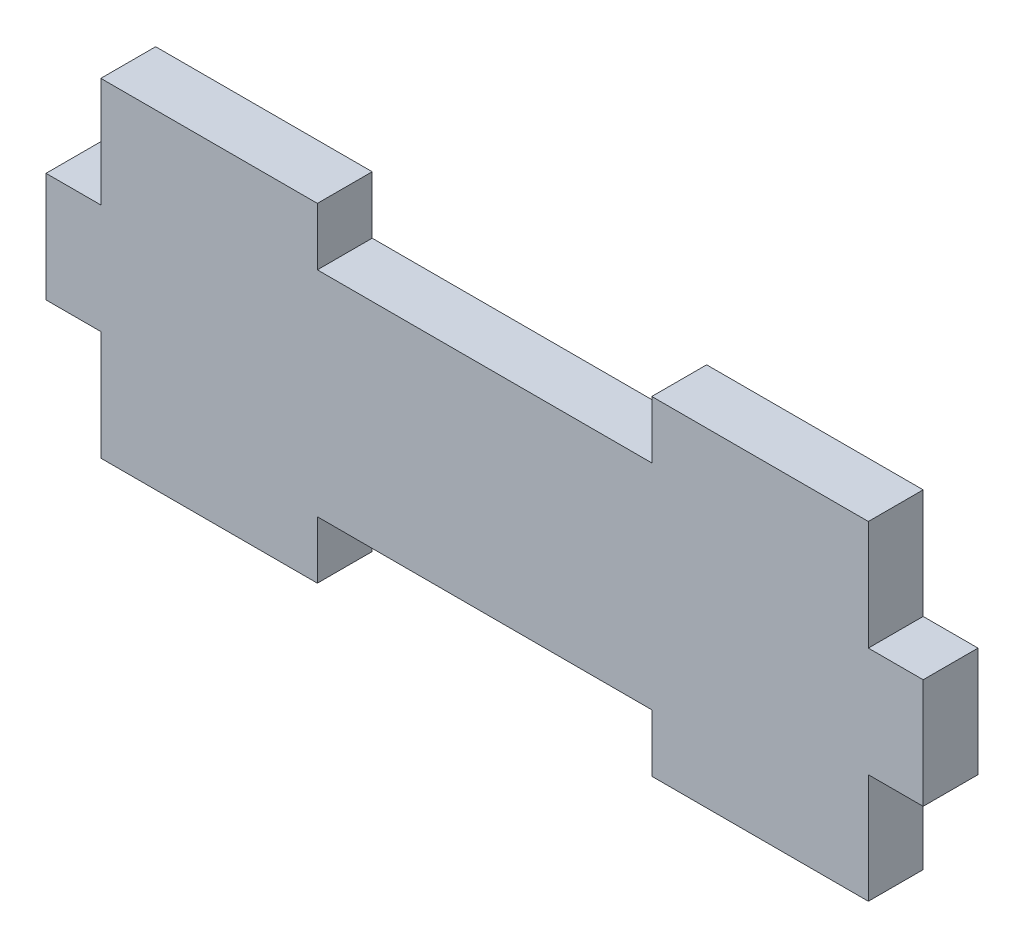
ISO-10303-21;
HEADER;
FILE_DESCRIPTION(('STEP AP214'),'2;1');
FILE_NAME('part.step','',(''),(''),'','','');
FILE_SCHEMA(('AUTOMOTIVE_DESIGN { 1 0 10303 214 1 1 1 1 }'));
ENDSEC;
DATA;
#1=APPLICATION_CONTEXT('core data for automotive mechanical design processes');
#2=APPLICATION_PROTOCOL_DEFINITION('international standard','automotive_design',2000,#1);
#3=PRODUCT_CONTEXT('',#1,'mechanical');
#4=PRODUCT('Part','Part','',(#3));
#5=PRODUCT_RELATED_PRODUCT_CATEGORY('part','',(#4));
#6=PRODUCT_DEFINITION_FORMATION('','',#4);
#7=PRODUCT_DEFINITION_CONTEXT('part definition',#1,'design');
#8=PRODUCT_DEFINITION('design','',#6,#7);
#9=PRODUCT_DEFINITION_SHAPE('','',#8);
#10=(LENGTH_UNIT() NAMED_UNIT(*) SI_UNIT(.MILLI.,.METRE.));
#11=(NAMED_UNIT(*) PLANE_ANGLE_UNIT() SI_UNIT($,.RADIAN.));
#12=(NAMED_UNIT(*) SI_UNIT($,.STERADIAN.) SOLID_ANGLE_UNIT());
#13=UNCERTAINTY_MEASURE_WITH_UNIT(LENGTH_MEASURE(1.E-05),#10,'distance_accuracy_value','');
#14=(GEOMETRIC_REPRESENTATION_CONTEXT(3) GLOBAL_UNCERTAINTY_ASSIGNED_CONTEXT((#13)) GLOBAL_UNIT_ASSIGNED_CONTEXT((#10,
#11,#12)) REPRESENTATION_CONTEXT('',''));
#15=CARTESIAN_POINT('',(0.,0.,0.));
#16=DIRECTION('',(0.,0.,1.));
#17=DIRECTION('',(1.,0.,0.));
#18=AXIS2_PLACEMENT_3D('',#15,#16,#17);
#19=CARTESIAN_POINT('',(-161.50297554201,-123.72908659893,2.5));
#20=DIRECTION('',(0.,-1.,0.));
#21=DIRECTION('',(1.,0.,0.));
#22=AXIS2_PLACEMENT_3D('',#19,#20,#21);
#23=PLANE('',#22);
#24=DIRECTION('',(-1.,0.,0.));
#25=VECTOR('',#24,1.);
#26=CARTESIAN_POINT('',(-161.50297554201,-123.72908659893,-2.5));
#27=LINE('',#26,#25);
#28=CARTESIAN_POINT('',(-161.50297554201,-123.72908659893,-2.5));
#29=VERTEX_POINT('',#28);
#30=CARTESIAN_POINT('',(-181.252975542007,-123.72908659893,-2.5));
#31=VERTEX_POINT('',#30);
#32=EDGE_CURVE('E201',#29,#31,#27,.T.);
#33=ORIENTED_EDGE('',*,*,#32,.T.);
#34=DIRECTION('',(0.,0.,-1.));
#35=VECTOR('',#34,1.);
#36=CARTESIAN_POINT('',(-181.252975542007,-123.72908659893,2.5));
#37=LINE('',#36,#35);
#38=CARTESIAN_POINT('',(-181.252975542007,-123.72908659893,2.5));
#39=VERTEX_POINT('',#38);
#40=EDGE_CURVE('E11',#39,#31,#37,.T.);
#41=ORIENTED_EDGE('',*,*,#40,.F.);
#42=DIRECTION('',(-1.,0.,0.));
#43=VECTOR('',#42,1.);
#44=CARTESIAN_POINT('',(-161.50297554201,-123.72908659893,2.5));
#45=LINE('',#44,#43);
#46=CARTESIAN_POINT('',(-161.50297554201,-123.72908659893,2.5));
#47=VERTEX_POINT('',#46);
#48=EDGE_CURVE('E239',#47,#39,#45,.T.);
#49=ORIENTED_EDGE('',*,*,#48,.F.);
#50=DIRECTION('',(0.,0.,-1.));
#51=VECTOR('',#50,1.);
#52=CARTESIAN_POINT('',(-161.50297554201,-123.72908659893,2.5));
#53=LINE('',#52,#51);
#54=EDGE_CURVE('E197',#47,#29,#53,.T.);
#55=ORIENTED_EDGE('',*,*,#54,.T.);
#56=EDGE_LOOP('',(#33,#41,#49,#55));
#57=FACE_BOUND('',#56,.T.);
#58=ADVANCED_FACE('F33',(#57),#23,.F.);
#59=CARTESIAN_POINT('',(-181.252975542007,-123.72908659893,2.5));
#60=DIRECTION('',(1.,0.,0.));
#61=DIRECTION('',(0.,0.,-1.));
#62=AXIS2_PLACEMENT_3D('',#59,#60,#61);
#63=PLANE('',#62);
#64=DIRECTION('',(0.,-1.,0.));
#65=VECTOR('',#64,1.);
#66=CARTESIAN_POINT('',(-181.252975542007,-123.72908659893,-2.5));
#67=LINE('',#66,#65);
#68=CARTESIAN_POINT('',(-181.252975542007,-133.72908659893,-2.5));
#69=VERTEX_POINT('',#68);
#70=EDGE_CURVE('E204',#31,#69,#67,.T.);
#71=ORIENTED_EDGE('',*,*,#70,.T.);
#72=DIRECTION('',(0.,0.,-1.));
#73=VECTOR('',#72,1.);
#74=CARTESIAN_POINT('',(-181.252975542007,-133.72908659893,2.5));
#75=LINE('',#74,#73);
#76=CARTESIAN_POINT('',(-181.252975542007,-133.72908659893,2.5));
#77=VERTEX_POINT('',#76);
#78=EDGE_CURVE('E41',#77,#69,#75,.T.);
#79=ORIENTED_EDGE('',*,*,#78,.F.);
#80=DIRECTION('',(0.,-1.,0.));
#81=VECTOR('',#80,1.);
#82=CARTESIAN_POINT('',(-181.252975542007,-123.72908659893,2.5));
#83=LINE('',#82,#81);
#84=EDGE_CURVE('E128',#39,#77,#83,.T.);
#85=ORIENTED_EDGE('',*,*,#84,.F.);
#86=ORIENTED_EDGE('',*,*,#40,.T.);
#87=EDGE_LOOP('',(#71,#79,#85,#86));
#88=FACE_BOUND('',#87,.T.);
#89=ADVANCED_FACE('F357',(#88),#63,.F.);
#90=CARTESIAN_POINT('',(-181.252975542007,-133.72908659893,2.5));
#91=DIRECTION('',(0.,-1.,0.));
#92=DIRECTION('',(0.,0.,-1.));
#93=AXIS2_PLACEMENT_3D('',#90,#91,#92);
#94=PLANE('',#93);
#95=DIRECTION('',(-1.,0.,0.));
#96=VECTOR('',#95,1.);
#97=CARTESIAN_POINT('',(-181.252975542007,-133.72908659893,-2.5));
#98=LINE('',#97,#96);
#99=CARTESIAN_POINT('',(-186.252975542008,-133.72908659893,-2.5));
#100=VERTEX_POINT('',#99);
#101=EDGE_CURVE('E206',#69,#100,#98,.T.);
#102=ORIENTED_EDGE('',*,*,#101,.T.);
#103=DIRECTION('',(0.,0.,-1.));
#104=VECTOR('',#103,1.);
#105=CARTESIAN_POINT('',(-186.252975542008,-133.72908659893,2.5));
#106=LINE('',#105,#104);
#107=CARTESIAN_POINT('',(-186.252975542008,-133.72908659893,2.5));
#108=VERTEX_POINT('',#107);
#109=EDGE_CURVE('E282',#108,#100,#106,.T.);
#110=ORIENTED_EDGE('',*,*,#109,.F.);
#111=DIRECTION('',(-1.,0.,0.));
#112=VECTOR('',#111,1.);
#113=CARTESIAN_POINT('',(-181.252975542007,-133.72908659893,2.5));
#114=LINE('',#113,#112);
#115=EDGE_CURVE('E290',#77,#108,#114,.T.);
#116=ORIENTED_EDGE('',*,*,#115,.F.);
#117=ORIENTED_EDGE('',*,*,#78,.T.);
#118=EDGE_LOOP('',(#102,#110,#116,#117));
#119=FACE_BOUND('',#118,.T.);
#120=ADVANCED_FACE('F288',(#119),#94,.F.);
#121=CARTESIAN_POINT('',(-186.252975542008,-133.72908659893,2.5));
#122=DIRECTION('',(1.,0.,0.));
#123=DIRECTION('',(0.,0.,-1.));
#124=AXIS2_PLACEMENT_3D('',#121,#122,#123);
#125=PLANE('',#124);
#126=DIRECTION('',(0.,-1.,0.));
#127=VECTOR('',#126,1.);
#128=CARTESIAN_POINT('',(-186.252975542008,-133.72908659893,-2.5));
#129=LINE('',#128,#127);
#130=CARTESIAN_POINT('',(-186.252975542008,-143.72908659893,-2.5));
#131=VERTEX_POINT('',#130);
#132=EDGE_CURVE('E208',#100,#131,#129,.T.);
#133=ORIENTED_EDGE('',*,*,#132,.T.);
#134=DIRECTION('',(0.,0.,-1.));
#135=VECTOR('',#134,1.);
#136=CARTESIAN_POINT('',(-186.252975542008,-143.72908659893,2.5));
#137=LINE('',#136,#135);
#138=CARTESIAN_POINT('',(-186.252975542008,-143.72908659893,2.5));
#139=VERTEX_POINT('',#138);
#140=EDGE_CURVE('E279',#139,#131,#137,.T.);
#141=ORIENTED_EDGE('',*,*,#140,.F.);
#142=DIRECTION('',(0.,-1.,0.));
#143=VECTOR('',#142,1.);
#144=CARTESIAN_POINT('',(-186.252975542008,-133.72908659893,2.5));
#145=LINE('',#144,#143);
#146=EDGE_CURVE('E308',#108,#139,#145,.T.);
#147=ORIENTED_EDGE('',*,*,#146,.F.);
#148=ORIENTED_EDGE('',*,*,#109,.T.);
#149=EDGE_LOOP('',(#133,#141,#147,#148));
#150=FACE_BOUND('',#149,.T.);
#151=ADVANCED_FACE('F299',(#150),#125,.F.);
#152=CARTESIAN_POINT('',(-186.252975542008,-143.72908659893,2.5));
#153=DIRECTION('',(0.,1.,0.));
#154=DIRECTION('',(0.,0.,1.));
#155=AXIS2_PLACEMENT_3D('',#152,#153,#154);
#156=PLANE('',#155);
#157=DIRECTION('',(1.,0.,0.));
#158=VECTOR('',#157,1.);
#159=CARTESIAN_POINT('',(-186.252975542008,-143.72908659893,-2.5));
#160=LINE('',#159,#158);
#161=CARTESIAN_POINT('',(-181.252975542007,-143.72908659893,-2.5));
#162=VERTEX_POINT('',#161);
#163=EDGE_CURVE('E210',#131,#162,#160,.T.);
#164=ORIENTED_EDGE('',*,*,#163,.T.);
#165=DIRECTION('',(0.,0.,-1.));
#166=VECTOR('',#165,1.);
#167=CARTESIAN_POINT('',(-181.252975542007,-143.72908659893,2.5));
#168=LINE('',#167,#166);
#169=CARTESIAN_POINT('',(-181.252975542007,-143.72908659893,2.5));
#170=VERTEX_POINT('',#169);
#171=EDGE_CURVE('E276',#170,#162,#168,.T.);
#172=ORIENTED_EDGE('',*,*,#171,.F.);
#173=DIRECTION('',(1.,0.,0.));
#174=VECTOR('',#173,1.);
#175=CARTESIAN_POINT('',(-186.252975542008,-143.72908659893,2.5));
#176=LINE('',#175,#174);
#177=EDGE_CURVE('E305',#139,#170,#176,.T.);
#178=ORIENTED_EDGE('',*,*,#177,.F.);
#179=ORIENTED_EDGE('',*,*,#140,.T.);
#180=EDGE_LOOP('',(#164,#172,#178,#179));
#181=FACE_BOUND('',#180,.T.);
#182=ADVANCED_FACE('F303',(#181),#156,.F.);
#183=CARTESIAN_POINT('',(-181.252975542007,-143.72908659893,2.5));
#184=DIRECTION('',(1.,0.,0.));
#185=DIRECTION('',(0.,0.,-1.));
#186=AXIS2_PLACEMENT_3D('',#183,#184,#185);
#187=PLANE('',#186);
#188=DIRECTION('',(0.,-1.,0.));
#189=VECTOR('',#188,1.);
#190=CARTESIAN_POINT('',(-181.252975542007,-143.72908659893,-2.5));
#191=LINE('',#190,#189);
#192=CARTESIAN_POINT('',(-181.252975542007,-153.729086598929,-2.5));
#193=VERTEX_POINT('',#192);
#194=EDGE_CURVE('E212',#162,#193,#191,.T.);
#195=ORIENTED_EDGE('',*,*,#194,.T.);
#196=DIRECTION('',(0.,0.,-1.));
#197=VECTOR('',#196,1.);
#198=CARTESIAN_POINT('',(-181.252975542007,-153.729086598929,2.5));
#199=LINE('',#198,#197);
#200=CARTESIAN_POINT('',(-181.252975542007,-153.729086598929,2.5));
#201=VERTEX_POINT('',#200);
#202=EDGE_CURVE('E273',#201,#193,#199,.T.);
#203=ORIENTED_EDGE('',*,*,#202,.F.);
#204=DIRECTION('',(0.,-1.,0.));
#205=VECTOR('',#204,1.);
#206=CARTESIAN_POINT('',(-181.252975542007,-143.72908659893,2.5));
#207=LINE('',#206,#205);
#208=EDGE_CURVE('E307',#170,#201,#207,.T.);
#209=ORIENTED_EDGE('',*,*,#208,.F.);
#210=ORIENTED_EDGE('',*,*,#171,.T.);
#211=EDGE_LOOP('',(#195,#203,#209,#210));
#212=FACE_BOUND('',#211,.T.);
#213=ADVANCED_FACE('F370',(#212),#187,.F.);
#214=CARTESIAN_POINT('',(-181.252975542007,-153.729086598929,2.5));
#215=DIRECTION('',(0.,1.,0.));
#216=DIRECTION('',(-1.,0.,0.));
#217=AXIS2_PLACEMENT_3D('',#214,#215,#216);
#218=PLANE('',#217);
#219=DIRECTION('',(1.,0.,0.));
#220=VECTOR('',#219,1.);
#221=CARTESIAN_POINT('',(-181.252975542007,-153.729086598929,-2.5));
#222=LINE('',#221,#220);
#223=CARTESIAN_POINT('',(-161.50297554201,-153.729086598929,-2.5));
#224=VERTEX_POINT('',#223);
#225=EDGE_CURVE('E214',#193,#224,#222,.T.);
#226=ORIENTED_EDGE('',*,*,#225,.T.);
#227=DIRECTION('',(0.,0.,-1.));
#228=VECTOR('',#227,1.);
#229=CARTESIAN_POINT('',(-161.50297554201,-153.729086598929,2.5));
#230=LINE('',#229,#228);
#231=CARTESIAN_POINT('',(-161.50297554201,-153.729086598929,2.5));
#232=VERTEX_POINT('',#231);
#233=EDGE_CURVE('E270',#232,#224,#230,.T.);
#234=ORIENTED_EDGE('',*,*,#233,.F.);
#235=DIRECTION('',(1.,0.,0.));
#236=VECTOR('',#235,1.);
#237=CARTESIAN_POINT('',(-181.252975542007,-153.729086598929,2.5));
#238=LINE('',#237,#236);
#239=EDGE_CURVE('E310',#201,#232,#238,.T.);
#240=ORIENTED_EDGE('',*,*,#239,.F.);
#241=ORIENTED_EDGE('',*,*,#202,.T.);
#242=EDGE_LOOP('',(#226,#234,#240,#241));
#243=FACE_BOUND('',#242,.T.);
#244=ADVANCED_FACE('F373',(#243),#218,.F.);
#245=CARTESIAN_POINT('',(-161.50297554201,-153.729086598929,2.5));
#246=DIRECTION('',(-1.,0.,0.));
#247=DIRECTION('',(0.,0.,1.));
#248=AXIS2_PLACEMENT_3D('',#245,#246,#247);
#249=PLANE('',#248);
#250=DIRECTION('',(0.,1.,0.));
#251=VECTOR('',#250,1.);
#252=CARTESIAN_POINT('',(-161.50297554201,-153.729086598929,-2.5));
#253=LINE('',#252,#251);
#254=CARTESIAN_POINT('',(-161.50297554201,-148.479086598928,-2.5));
#255=VERTEX_POINT('',#254);
#256=EDGE_CURVE('E216',#224,#255,#253,.T.);
#257=ORIENTED_EDGE('',*,*,#256,.T.);
#258=DIRECTION('',(0.,0.,-1.));
#259=VECTOR('',#258,1.);
#260=CARTESIAN_POINT('',(-161.50297554201,-148.479086598928,2.5));
#261=LINE('',#260,#259);
#262=CARTESIAN_POINT('',(-161.50297554201,-148.479086598928,2.5));
#263=VERTEX_POINT('',#262);
#264=EDGE_CURVE('E267',#263,#255,#261,.T.);
#265=ORIENTED_EDGE('',*,*,#264,.F.);
#266=DIRECTION('',(0.,1.,0.));
#267=VECTOR('',#266,1.);
#268=CARTESIAN_POINT('',(-161.50297554201,-153.729086598929,2.5));
#269=LINE('',#268,#267);
#270=EDGE_CURVE('E316',#232,#263,#269,.T.);
#271=ORIENTED_EDGE('',*,*,#270,.F.);
#272=ORIENTED_EDGE('',*,*,#233,.T.);
#273=EDGE_LOOP('',(#257,#265,#271,#272));
#274=FACE_BOUND('',#273,.T.);
#275=ADVANCED_FACE('F377',(#274),#249,.F.);
#276=CARTESIAN_POINT('',(-161.50297554201,-148.479086598928,2.5));
#277=DIRECTION('',(0.,1.,0.));
#278=DIRECTION('',(-1.,0.,0.));
#279=AXIS2_PLACEMENT_3D('',#276,#277,#278);
#280=PLANE('',#279);
#281=DIRECTION('',(1.,0.,0.));
#282=VECTOR('',#281,1.);
#283=CARTESIAN_POINT('',(-161.50297554201,-148.479086598928,-2.5));
#284=LINE('',#283,#282);
#285=CARTESIAN_POINT('',(-131.002975542008,-148.479086598929,-2.5));
#286=VERTEX_POINT('',#285);
#287=EDGE_CURVE('E218',#255,#286,#284,.T.);
#288=ORIENTED_EDGE('',*,*,#287,.T.);
#289=DIRECTION('',(0.,0.,-1.));
#290=VECTOR('',#289,1.);
#291=CARTESIAN_POINT('',(-131.002975542008,-148.479086598929,2.5));
#292=LINE('',#291,#290);
#293=CARTESIAN_POINT('',(-131.002975542008,-148.479086598929,2.5));
#294=VERTEX_POINT('',#293);
#295=EDGE_CURVE('E264',#294,#286,#292,.T.);
#296=ORIENTED_EDGE('',*,*,#295,.F.);
#297=DIRECTION('',(1.,0.,0.));
#298=VECTOR('',#297,1.);
#299=CARTESIAN_POINT('',(-161.50297554201,-148.479086598928,2.5));
#300=LINE('',#299,#298);
#301=EDGE_CURVE('E318',#263,#294,#300,.T.);
#302=ORIENTED_EDGE('',*,*,#301,.F.);
#303=ORIENTED_EDGE('',*,*,#264,.T.);
#304=EDGE_LOOP('',(#288,#296,#302,#303));
#305=FACE_BOUND('',#304,.T.);
#306=ADVANCED_FACE('F381',(#305),#280,.F.);
#307=CARTESIAN_POINT('',(-131.002975542008,-148.479086598929,2.5));
#308=DIRECTION('',(1.,0.,0.));
#309=DIRECTION('',(0.,0.,-1.));
#310=AXIS2_PLACEMENT_3D('',#307,#308,#309);
#311=PLANE('',#310);
#312=DIRECTION('',(0.,-1.,0.));
#313=VECTOR('',#312,1.);
#314=CARTESIAN_POINT('',(-131.002975542008,-148.479086598929,-2.5));
#315=LINE('',#314,#313);
#316=CARTESIAN_POINT('',(-131.002975542008,-153.729086598929,-2.5));
#317=VERTEX_POINT('',#316);
#318=EDGE_CURVE('E220',#286,#317,#315,.T.);
#319=ORIENTED_EDGE('',*,*,#318,.T.);
#320=DIRECTION('',(0.,0.,-1.));
#321=VECTOR('',#320,1.);
#322=CARTESIAN_POINT('',(-131.002975542008,-153.729086598929,2.5));
#323=LINE('',#322,#321);
#324=CARTESIAN_POINT('',(-131.002975542008,-153.729086598929,2.5));
#325=VERTEX_POINT('',#324);
#326=EDGE_CURVE('E261',#325,#317,#323,.T.);
#327=ORIENTED_EDGE('',*,*,#326,.F.);
#328=DIRECTION('',(0.,-1.,0.));
#329=VECTOR('',#328,1.);
#330=CARTESIAN_POINT('',(-131.002975542008,-148.479086598929,2.5));
#331=LINE('',#330,#329);
#332=EDGE_CURVE('E320',#294,#325,#331,.T.);
#333=ORIENTED_EDGE('',*,*,#332,.F.);
#334=ORIENTED_EDGE('',*,*,#295,.T.);
#335=EDGE_LOOP('',(#319,#327,#333,#334));
#336=FACE_BOUND('',#335,.T.);
#337=ADVANCED_FACE('F385',(#336),#311,.F.);
#338=CARTESIAN_POINT('',(-111.252975542008,-153.729086598929,2.5));
#339=DIRECTION('',(0.,1.,0.));
#340=DIRECTION('',(0.,0.,1.));
#341=AXIS2_PLACEMENT_3D('',#338,#339,#340);
#342=PLANE('',#341);
#343=DIRECTION('',(1.,0.,0.));
#344=VECTOR('',#343,1.);
#345=CARTESIAN_POINT('',(-111.252975542008,-153.729086598929,-2.5));
#346=LINE('',#345,#344);
#347=CARTESIAN_POINT('',(-111.252975542008,-153.729086598929,-2.5));
#348=VERTEX_POINT('',#347);
#349=EDGE_CURVE('E222',#317,#348,#346,.T.);
#350=ORIENTED_EDGE('',*,*,#349,.T.);
#351=DIRECTION('',(0.,0.,-1.));
#352=VECTOR('',#351,1.);
#353=CARTESIAN_POINT('',(-111.252975542008,-153.729086598929,2.5));
#354=LINE('',#353,#352);
#355=CARTESIAN_POINT('',(-111.252975542008,-153.729086598929,2.5));
#356=VERTEX_POINT('',#355);
#357=EDGE_CURVE('E258',#356,#348,#354,.T.);
#358=ORIENTED_EDGE('',*,*,#357,.F.);
#359=DIRECTION('',(1.,0.,0.));
#360=VECTOR('',#359,1.);
#361=CARTESIAN_POINT('',(-111.252975542008,-153.729086598929,2.5));
#362=LINE('',#361,#360);
#363=EDGE_CURVE('E322',#325,#356,#362,.T.);
#364=ORIENTED_EDGE('',*,*,#363,.F.);
#365=ORIENTED_EDGE('',*,*,#326,.T.);
#366=EDGE_LOOP('',(#350,#358,#364,#365));
#367=FACE_BOUND('',#366,.T.);
#368=ADVANCED_FACE('F389',(#367),#342,.F.);
#369=CARTESIAN_POINT('',(-111.252975542008,-143.729086598929,2.5));
#370=DIRECTION('',(-1.,0.,0.));
#371=DIRECTION('',(0.,0.,1.));
#372=AXIS2_PLACEMENT_3D('',#369,#370,#371);
#373=PLANE('',#372);
#374=DIRECTION('',(0.,1.,0.));
#375=VECTOR('',#374,1.);
#376=CARTESIAN_POINT('',(-111.252975542008,-143.729086598929,-2.5));
#377=LINE('',#376,#375);
#378=CARTESIAN_POINT('',(-111.252975542008,-143.729086598929,-2.5));
#379=VERTEX_POINT('',#378);
#380=EDGE_CURVE('E224',#348,#379,#377,.T.);
#381=ORIENTED_EDGE('',*,*,#380,.T.);
#382=DIRECTION('',(0.,0.,-1.));
#383=VECTOR('',#382,1.);
#384=CARTESIAN_POINT('',(-111.252975542008,-143.729086598929,2.5));
#385=LINE('',#384,#383);
#386=CARTESIAN_POINT('',(-111.252975542008,-143.729086598929,2.5));
#387=VERTEX_POINT('',#386);
#388=EDGE_CURVE('E255',#387,#379,#385,.T.);
#389=ORIENTED_EDGE('',*,*,#388,.F.);
#390=DIRECTION('',(0.,1.,0.));
#391=VECTOR('',#390,1.);
#392=CARTESIAN_POINT('',(-111.252975542008,-143.729086598929,2.5));
#393=LINE('',#392,#391);
#394=EDGE_CURVE('E324',#356,#387,#393,.T.);
#395=ORIENTED_EDGE('',*,*,#394,.F.);
#396=ORIENTED_EDGE('',*,*,#357,.T.);
#397=EDGE_LOOP('',(#381,#389,#395,#396));
#398=FACE_BOUND('',#397,.T.);
#399=ADVANCED_FACE('F393',(#398),#373,.F.);
#400=CARTESIAN_POINT('',(-106.252975542006,-143.72908659893,2.5));
#401=DIRECTION('',(1.4432899320122E-13,1.,0.));
#402=DIRECTION('',(-1.,1.4432899320122E-13,0.));
#403=AXIS2_PLACEMENT_3D('',#400,#401,#402);
#404=PLANE('',#403);
#405=DIRECTION('',(1.,-1.4432899320122E-13,0.));
#406=VECTOR('',#405,1.);
#407=CARTESIAN_POINT('',(-106.252975542006,-143.72908659893,-2.5));
#408=LINE('',#407,#406);
#409=CARTESIAN_POINT('',(-106.252975542006,-143.72908659893,-2.5));
#410=VERTEX_POINT('',#409);
#411=EDGE_CURVE('E226',#379,#410,#408,.T.);
#412=ORIENTED_EDGE('',*,*,#411,.T.);
#413=DIRECTION('',(0.,0.,-1.));
#414=VECTOR('',#413,1.);
#415=CARTESIAN_POINT('',(-106.252975542006,-143.72908659893,2.5));
#416=LINE('',#415,#414);
#417=CARTESIAN_POINT('',(-106.252975542006,-143.72908659893,2.5));
#418=VERTEX_POINT('',#417);
#419=EDGE_CURVE('E252',#418,#410,#416,.T.);
#420=ORIENTED_EDGE('',*,*,#419,.F.);
#421=DIRECTION('',(1.,-1.4432899320122E-13,0.));
#422=VECTOR('',#421,1.);
#423=CARTESIAN_POINT('',(-106.252975542006,-143.72908659893,2.5));
#424=LINE('',#423,#422);
#425=EDGE_CURVE('E326',#387,#418,#424,.T.);
#426=ORIENTED_EDGE('',*,*,#425,.F.);
#427=ORIENTED_EDGE('',*,*,#388,.T.);
#428=EDGE_LOOP('',(#412,#420,#426,#427));
#429=FACE_BOUND('',#428,.T.);
#430=ADVANCED_FACE('F397',(#429),#404,.F.);
#431=CARTESIAN_POINT('',(-106.252975542006,-133.72908659893,2.5));
#432=DIRECTION('',(-1.,0.,0.));
#433=DIRECTION('',(0.,0.,1.));
#434=AXIS2_PLACEMENT_3D('',#431,#432,#433);
#435=PLANE('',#434);
#436=DIRECTION('',(0.,1.,0.));
#437=VECTOR('',#436,1.);
#438=CARTESIAN_POINT('',(-106.252975542006,-133.72908659893,-2.5));
#439=LINE('',#438,#437);
#440=CARTESIAN_POINT('',(-106.252975542006,-133.72908659893,-2.5));
#441=VERTEX_POINT('',#440);
#442=EDGE_CURVE('E228',#410,#441,#439,.T.);
#443=ORIENTED_EDGE('',*,*,#442,.T.);
#444=DIRECTION('',(0.,0.,-1.));
#445=VECTOR('',#444,1.);
#446=CARTESIAN_POINT('',(-106.252975542006,-133.72908659893,2.5));
#447=LINE('',#446,#445);
#448=CARTESIAN_POINT('',(-106.252975542006,-133.72908659893,2.5));
#449=VERTEX_POINT('',#448);
#450=EDGE_CURVE('E249',#449,#441,#447,.T.);
#451=ORIENTED_EDGE('',*,*,#450,.F.);
#452=DIRECTION('',(0.,1.,0.));
#453=VECTOR('',#452,1.);
#454=CARTESIAN_POINT('',(-106.252975542006,-133.72908659893,2.5));
#455=LINE('',#454,#453);
#456=EDGE_CURVE('E328',#418,#449,#455,.T.);
#457=ORIENTED_EDGE('',*,*,#456,.F.);
#458=ORIENTED_EDGE('',*,*,#419,.T.);
#459=EDGE_LOOP('',(#443,#451,#457,#458));
#460=FACE_BOUND('',#459,.T.);
#461=ADVANCED_FACE('F401',(#460),#435,.F.);
#462=CARTESIAN_POINT('',(-111.252975542008,-133.72908659893,2.5));
#463=DIRECTION('',(0.,-1.,0.));
#464=DIRECTION('',(0.,0.,-1.));
#465=AXIS2_PLACEMENT_3D('',#462,#463,#464);
#466=PLANE('',#465);
#467=DIRECTION('',(-1.,0.,0.));
#468=VECTOR('',#467,1.);
#469=CARTESIAN_POINT('',(-111.252975542008,-133.72908659893,-2.5));
#470=LINE('',#469,#468);
#471=CARTESIAN_POINT('',(-111.252975542008,-133.72908659893,-2.5));
#472=VERTEX_POINT('',#471);
#473=EDGE_CURVE('E230',#441,#472,#470,.T.);
#474=ORIENTED_EDGE('',*,*,#473,.T.);
#475=DIRECTION('',(0.,0.,-1.));
#476=VECTOR('',#475,1.);
#477=CARTESIAN_POINT('',(-111.252975542008,-133.72908659893,2.5));
#478=LINE('',#477,#476);
#479=CARTESIAN_POINT('',(-111.252975542008,-133.72908659893,2.5));
#480=VERTEX_POINT('',#479);
#481=EDGE_CURVE('E246',#480,#472,#478,.T.);
#482=ORIENTED_EDGE('',*,*,#481,.F.);
#483=DIRECTION('',(-1.,0.,0.));
#484=VECTOR('',#483,1.);
#485=CARTESIAN_POINT('',(-111.252975542008,-133.72908659893,2.5));
#486=LINE('',#485,#484);
#487=EDGE_CURVE('E330',#449,#480,#486,.T.);
#488=ORIENTED_EDGE('',*,*,#487,.F.);
#489=ORIENTED_EDGE('',*,*,#450,.T.);
#490=EDGE_LOOP('',(#474,#482,#488,#489));
#491=FACE_BOUND('',#490,.T.);
#492=ADVANCED_FACE('F405',(#491),#466,.F.);
#493=CARTESIAN_POINT('',(-111.252975542008,-123.72908659893,2.5));
#494=DIRECTION('',(-1.,0.,0.));
#495=DIRECTION('',(0.,0.,1.));
#496=AXIS2_PLACEMENT_3D('',#493,#494,#495);
#497=PLANE('',#496);
#498=DIRECTION('',(0.,1.,0.));
#499=VECTOR('',#498,1.);
#500=CARTESIAN_POINT('',(-111.252975542008,-123.72908659893,-2.5));
#501=LINE('',#500,#499);
#502=CARTESIAN_POINT('',(-111.252975542008,-123.72908659893,-2.5));
#503=VERTEX_POINT('',#502);
#504=EDGE_CURVE('E232',#472,#503,#501,.T.);
#505=ORIENTED_EDGE('',*,*,#504,.T.);
#506=DIRECTION('',(0.,0.,-1.));
#507=VECTOR('',#506,1.);
#508=CARTESIAN_POINT('',(-111.252975542008,-123.72908659893,2.5));
#509=LINE('',#508,#507);
#510=CARTESIAN_POINT('',(-111.252975542008,-123.72908659893,2.5));
#511=VERTEX_POINT('',#510);
#512=EDGE_CURVE('E243',#511,#503,#509,.T.);
#513=ORIENTED_EDGE('',*,*,#512,.F.);
#514=DIRECTION('',(0.,1.,0.));
#515=VECTOR('',#514,1.);
#516=CARTESIAN_POINT('',(-111.252975542008,-123.72908659893,2.5));
#517=LINE('',#516,#515);
#518=EDGE_CURVE('E332',#480,#511,#517,.T.);
#519=ORIENTED_EDGE('',*,*,#518,.F.);
#520=ORIENTED_EDGE('',*,*,#481,.T.);
#521=EDGE_LOOP('',(#505,#513,#519,#520));
#522=FACE_BOUND('',#521,.T.);
#523=ADVANCED_FACE('F338',(#522),#497,.F.);
#524=CARTESIAN_POINT('',(-131.002975542008,-123.72908659893,2.5));
#525=DIRECTION('',(0.,-1.,0.));
#526=DIRECTION('',(0.,0.,-1.));
#527=AXIS2_PLACEMENT_3D('',#524,#525,#526);
#528=PLANE('',#527);
#529=DIRECTION('',(-1.,0.,0.));
#530=VECTOR('',#529,1.);
#531=CARTESIAN_POINT('',(-131.002975542008,-123.72908659893,-2.5));
#532=LINE('',#531,#530);
#533=CARTESIAN_POINT('',(-131.002975542008,-123.72908659893,-2.5));
#534=VERTEX_POINT('',#533);
#535=EDGE_CURVE('E234',#503,#534,#532,.T.);
#536=ORIENTED_EDGE('',*,*,#535,.T.);
#537=DIRECTION('',(0.,0.,-1.));
#538=VECTOR('',#537,1.);
#539=CARTESIAN_POINT('',(-131.002975542008,-123.72908659893,2.5));
#540=LINE('',#539,#538);
#541=CARTESIAN_POINT('',(-131.002975542008,-123.72908659893,2.5));
#542=VERTEX_POINT('',#541);
#543=EDGE_CURVE('E192',#542,#534,#540,.T.);
#544=ORIENTED_EDGE('',*,*,#543,.F.);
#545=DIRECTION('',(-1.,0.,0.));
#546=VECTOR('',#545,1.);
#547=CARTESIAN_POINT('',(-131.002975542008,-123.72908659893,2.5));
#548=LINE('',#547,#546);
#549=EDGE_CURVE('E183',#511,#542,#548,.T.);
#550=ORIENTED_EDGE('',*,*,#549,.F.);
#551=ORIENTED_EDGE('',*,*,#512,.T.);
#552=EDGE_LOOP('',(#536,#544,#550,#551));
#553=FACE_BOUND('',#552,.T.);
#554=ADVANCED_FACE('F342',(#553),#528,.F.);
#555=CARTESIAN_POINT('',(-131.002975542008,-128.97908659893,2.5));
#556=DIRECTION('',(1.,0.,0.));
#557=DIRECTION('',(0.,0.,-1.));
#558=AXIS2_PLACEMENT_3D('',#555,#556,#557);
#559=PLANE('',#558);
#560=DIRECTION('',(0.,-1.,0.));
#561=VECTOR('',#560,1.);
#562=CARTESIAN_POINT('',(-131.002975542008,-128.97908659893,-2.5));
#563=LINE('',#562,#561);
#564=CARTESIAN_POINT('',(-131.002975542008,-128.97908659893,-2.5));
#565=VERTEX_POINT('',#564);
#566=EDGE_CURVE('E191',#534,#565,#563,.T.);
#567=ORIENTED_EDGE('',*,*,#566,.T.);
#568=DIRECTION('',(0.,0.,-1.));
#569=VECTOR('',#568,1.);
#570=CARTESIAN_POINT('',(-131.002975542008,-128.97908659893,2.5));
#571=LINE('',#570,#569);
#572=CARTESIAN_POINT('',(-131.002975542008,-128.97908659893,2.5));
#573=VERTEX_POINT('',#572);
#574=EDGE_CURVE('E188',#573,#565,#571,.T.);
#575=ORIENTED_EDGE('',*,*,#574,.F.);
#576=DIRECTION('',(0.,-1.,0.));
#577=VECTOR('',#576,1.);
#578=CARTESIAN_POINT('',(-131.002975542008,-128.97908659893,2.5));
#579=LINE('',#578,#577);
#580=EDGE_CURVE('E177',#542,#573,#579,.T.);
#581=ORIENTED_EDGE('',*,*,#580,.F.);
#582=ORIENTED_EDGE('',*,*,#543,.T.);
#583=EDGE_LOOP('',(#567,#575,#581,#582));
#584=FACE_BOUND('',#583,.T.);
#585=ADVANCED_FACE('F189',(#584),#559,.F.);
#586=CARTESIAN_POINT('',(-161.50297554201,-128.979086598931,2.5));
#587=DIRECTION('',(0.,-1.,0.));
#588=DIRECTION('',(1.,0.,0.));
#589=AXIS2_PLACEMENT_3D('',#586,#587,#588);
#590=PLANE('',#589);
#591=DIRECTION('',(-1.,0.,0.));
#592=VECTOR('',#591,1.);
#593=CARTESIAN_POINT('',(-161.50297554201,-128.979086598931,-2.5));
#594=LINE('',#593,#592);
#595=CARTESIAN_POINT('',(-161.50297554201,-128.979086598931,-2.5));
#596=VERTEX_POINT('',#595);
#597=EDGE_CURVE('E114',#565,#596,#594,.T.);
#598=ORIENTED_EDGE('',*,*,#597,.T.);
#599=DIRECTION('',(0.,0.,-1.));
#600=VECTOR('',#599,1.);
#601=CARTESIAN_POINT('',(-161.50297554201,-128.979086598931,2.5));
#602=LINE('',#601,#600);
#603=CARTESIAN_POINT('',(-161.50297554201,-128.979086598931,2.5));
#604=VERTEX_POINT('',#603);
#605=EDGE_CURVE('E193',#604,#596,#602,.T.);
#606=ORIENTED_EDGE('',*,*,#605,.F.);
#607=DIRECTION('',(-1.,0.,0.));
#608=VECTOR('',#607,1.);
#609=CARTESIAN_POINT('',(-161.50297554201,-128.979086598931,2.5));
#610=LINE('',#609,#608);
#611=EDGE_CURVE('E181',#573,#604,#610,.T.);
#612=ORIENTED_EDGE('',*,*,#611,.F.);
#613=ORIENTED_EDGE('',*,*,#574,.T.);
#614=EDGE_LOOP('',(#598,#606,#612,#613));
#615=FACE_BOUND('',#614,.T.);
#616=ADVANCED_FACE('F195',(#615),#590,.F.);
#617=CARTESIAN_POINT('',(-161.50297554201,-123.72908659893,2.5));
#618=DIRECTION('',(-1.,0.,0.));
#619=DIRECTION('',(0.,0.,1.));
#620=AXIS2_PLACEMENT_3D('',#617,#618,#619);
#621=PLANE('',#620);
#622=DIRECTION('',(0.,1.,0.));
#623=VECTOR('',#622,1.);
#624=CARTESIAN_POINT('',(-161.50297554201,-123.72908659893,-2.5));
#625=LINE('',#624,#623);
#626=EDGE_CURVE('E120',#596,#29,#625,.T.);
#627=ORIENTED_EDGE('',*,*,#626,.T.);
#628=ORIENTED_EDGE('',*,*,#54,.F.);
#629=DIRECTION('',(0.,1.,0.));
#630=VECTOR('',#629,1.);
#631=CARTESIAN_POINT('',(-161.50297554201,-123.72908659893,2.5));
#632=LINE('',#631,#630);
#633=EDGE_CURVE('E49',#604,#47,#632,.T.);
#634=ORIENTED_EDGE('',*,*,#633,.F.);
#635=ORIENTED_EDGE('',*,*,#605,.T.);
#636=EDGE_LOOP('',(#627,#628,#634,#635));
#637=FACE_BOUND('',#636,.T.);
#638=ADVANCED_FACE('F346',(#637),#621,.F.);
#639=CARTESIAN_POINT('',(0.,0.,2.5));
#640=DIRECTION('',(0.,0.,1.));
#641=DIRECTION('',(1.,0.,0.));
#642=AXIS2_PLACEMENT_3D('',#639,#640,#641);
#643=PLANE('',#642);
#644=ORIENTED_EDGE('',*,*,#48,.T.);
#645=ORIENTED_EDGE('',*,*,#84,.T.);
#646=ORIENTED_EDGE('',*,*,#115,.T.);
#647=ORIENTED_EDGE('',*,*,#146,.T.);
#648=ORIENTED_EDGE('',*,*,#177,.T.);
#649=ORIENTED_EDGE('',*,*,#208,.T.);
#650=ORIENTED_EDGE('',*,*,#239,.T.);
#651=ORIENTED_EDGE('',*,*,#270,.T.);
#652=ORIENTED_EDGE('',*,*,#301,.T.);
#653=ORIENTED_EDGE('',*,*,#332,.T.);
#654=ORIENTED_EDGE('',*,*,#363,.T.);
#655=ORIENTED_EDGE('',*,*,#394,.T.);
#656=ORIENTED_EDGE('',*,*,#425,.T.);
#657=ORIENTED_EDGE('',*,*,#456,.T.);
#658=ORIENTED_EDGE('',*,*,#487,.T.);
#659=ORIENTED_EDGE('',*,*,#518,.T.);
#660=ORIENTED_EDGE('',*,*,#549,.T.);
#661=ORIENTED_EDGE('',*,*,#580,.T.);
#662=ORIENTED_EDGE('',*,*,#611,.T.);
#663=ORIENTED_EDGE('',*,*,#633,.T.);
#664=EDGE_LOOP('',(#644,#645,#646,#647,#648,#649,#650,#651,#652,#653,#654,#655,#656,#657,#658,
#659,#660,#661,#662,#663));
#665=FACE_BOUND('',#664,.T.);
#666=ADVANCED_FACE('F179',(#665),#643,.T.);
#667=CARTESIAN_POINT('',(0.,0.,-2.5));
#668=DIRECTION('',(0.,0.,1.));
#669=DIRECTION('',(1.,0.,0.));
#670=AXIS2_PLACEMENT_3D('',#667,#668,#669);
#671=PLANE('',#670);
#672=ORIENTED_EDGE('',*,*,#32,.F.);
#673=ORIENTED_EDGE('',*,*,#626,.F.);
#674=ORIENTED_EDGE('',*,*,#597,.F.);
#675=ORIENTED_EDGE('',*,*,#566,.F.);
#676=ORIENTED_EDGE('',*,*,#535,.F.);
#677=ORIENTED_EDGE('',*,*,#504,.F.);
#678=ORIENTED_EDGE('',*,*,#473,.F.);
#679=ORIENTED_EDGE('',*,*,#442,.F.);
#680=ORIENTED_EDGE('',*,*,#411,.F.);
#681=ORIENTED_EDGE('',*,*,#380,.F.);
#682=ORIENTED_EDGE('',*,*,#349,.F.);
#683=ORIENTED_EDGE('',*,*,#318,.F.);
#684=ORIENTED_EDGE('',*,*,#287,.F.);
#685=ORIENTED_EDGE('',*,*,#256,.F.);
#686=ORIENTED_EDGE('',*,*,#225,.F.);
#687=ORIENTED_EDGE('',*,*,#194,.F.);
#688=ORIENTED_EDGE('',*,*,#163,.F.);
#689=ORIENTED_EDGE('',*,*,#132,.F.);
#690=ORIENTED_EDGE('',*,*,#101,.F.);
#691=ORIENTED_EDGE('',*,*,#70,.F.);
#692=EDGE_LOOP('',(#672,#673,#674,#675,#676,#677,#678,#679,#680,#681,#682,#683,#684,#685,#686,
#687,#688,#689,#690,#691));
#693=FACE_BOUND('',#692,.T.);
#694=ADVANCED_FACE('F294',(#693),#671,.F.);
#695=CLOSED_SHELL('',(#58,#89,#120,#151,#182,#213,#244,#275,#306,#337,#368,#399,#430,#461,#492,
#523,#554,#585,#616,#638,#666,#694));
#696=MANIFOLD_SOLID_BREP('B2',#695);
#697=ADVANCED_BREP_SHAPE_REPRESENTATION('',(#18,#696),#14);
#698=SHAPE_DEFINITION_REPRESENTATION(#9,#697);
ENDSEC;
END-ISO-10303-21;
